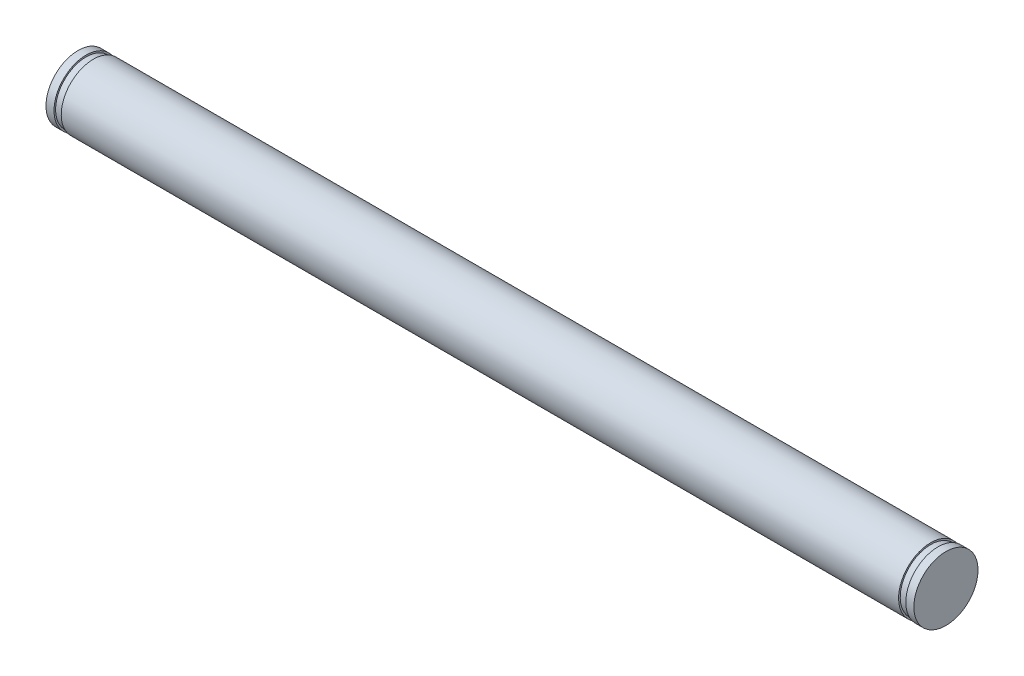
ISO-10303-21;
HEADER;
FILE_DESCRIPTION(('STEP AP214'),'2;1');
FILE_NAME('part.step','',(''),(''),'','','');
FILE_SCHEMA(('AUTOMOTIVE_DESIGN { 1 0 10303 214 1 1 1 1 }'));
ENDSEC;
DATA;
#1=APPLICATION_CONTEXT('core data for automotive mechanical design processes');
#2=APPLICATION_PROTOCOL_DEFINITION('international standard','automotive_design',2000,#1);
#3=PRODUCT_CONTEXT('',#1,'mechanical');
#4=PRODUCT('Part','Part','',(#3));
#5=PRODUCT_RELATED_PRODUCT_CATEGORY('part','',(#4));
#6=PRODUCT_DEFINITION_FORMATION('','',#4);
#7=PRODUCT_DEFINITION_CONTEXT('part definition',#1,'design');
#8=PRODUCT_DEFINITION('design','',#6,#7);
#9=PRODUCT_DEFINITION_SHAPE('','',#8);
#10=(LENGTH_UNIT() NAMED_UNIT(*) SI_UNIT(.MILLI.,.METRE.));
#11=(NAMED_UNIT(*) PLANE_ANGLE_UNIT() SI_UNIT($,.RADIAN.));
#12=(NAMED_UNIT(*) SI_UNIT($,.STERADIAN.) SOLID_ANGLE_UNIT());
#13=UNCERTAINTY_MEASURE_WITH_UNIT(LENGTH_MEASURE(1.E-05),#10,'distance_accuracy_value','');
#14=(GEOMETRIC_REPRESENTATION_CONTEXT(3) GLOBAL_UNCERTAINTY_ASSIGNED_CONTEXT((#13)) GLOBAL_UNIT_ASSIGNED_CONTEXT((#10,
#11,#12)) REPRESENTATION_CONTEXT('',''));
#15=CARTESIAN_POINT('',(0.,0.,0.));
#16=DIRECTION('',(0.,0.,1.));
#17=DIRECTION('',(1.,0.,0.));
#18=AXIS2_PLACEMENT_3D('',#15,#16,#17);
#19=CARTESIAN_POINT('',(0.,-0.200000000000025,0.));
#20=DIRECTION('',(-1.,0.,0.));
#21=DIRECTION('',(0.,-1.,0.));
#22=AXIS2_PLACEMENT_3D('',#19,#20,#21);
#23=PLANE('',#22);
#24=CARTESIAN_POINT('',(0.,-4.00000000000003,0.));
#25=DIRECTION('',(1.,0.,0.));
#26=DIRECTION('',(0.,1.,0.));
#27=AXIS2_PLACEMENT_3D('',#24,#25,#26);
#28=CIRCLE('',#27,3.8);
#29=CARTESIAN_POINT('',(0.,-0.200000000000025,0.));
#30=VERTEX_POINT('',#29);
#31=EDGE_CURVE('E67',#30,#30,#28,.T.);
#32=ORIENTED_EDGE('',*,*,#31,.T.);
#33=EDGE_LOOP('',(#32));
#34=FACE_BOUND('',#33,.T.);
#35=CARTESIAN_POINT('',(0.,-4.00000000000003,0.));
#36=DIRECTION('',(1.,0.,0.));
#37=DIRECTION('',(0.,1.,0.));
#38=AXIS2_PLACEMENT_3D('',#35,#36,#37);
#39=CIRCLE('',#38,4.00000000000003);
#40=CARTESIAN_POINT('',(0.,0.,0.));
#41=VERTEX_POINT('',#40);
#42=EDGE_CURVE('E10',#41,#41,#39,.T.);
#43=ORIENTED_EDGE('',*,*,#42,.F.);
#44=EDGE_LOOP('',(#43));
#45=FACE_BOUND('',#44,.T.);
#46=ADVANCED_FACE('F33',(#34,#45),#23,.T.);
#47=CARTESIAN_POINT('',(106.3,-3.99999999999999,0.));
#48=DIRECTION('',(1.,0.,0.));
#49=DIRECTION('',(0.,1.,0.));
#50=AXIS2_PLACEMENT_3D('',#47,#48,#49);
#51=CYLINDRICAL_SURFACE('',#50,4.00000000000002);
#52=ORIENTED_EDGE('',*,*,#42,.T.);
#53=EDGE_LOOP('',(#52));
#54=FACE_BOUND('',#53,.T.);
#55=CARTESIAN_POINT('',(104.4,-3.99999999999999,0.));
#56=DIRECTION('',(1.,0.,0.));
#57=DIRECTION('',(0.,1.,0.));
#58=AXIS2_PLACEMENT_3D('',#55,#56,#57);
#59=CIRCLE('',#58,4.);
#60=CARTESIAN_POINT('',(104.4,0.,0.));
#61=VERTEX_POINT('',#60);
#62=EDGE_CURVE('E39',#61,#61,#59,.T.);
#63=ORIENTED_EDGE('',*,*,#62,.F.);
#64=EDGE_LOOP('',(#63));
#65=FACE_BOUND('',#64,.T.);
#66=ADVANCED_FACE('F85',(#54,#65),#51,.T.);
#67=CARTESIAN_POINT('',(104.4,0.,0.));
#68=DIRECTION('',(1.,0.,0.));
#69=DIRECTION('',(0.,1.,0.));
#70=AXIS2_PLACEMENT_3D('',#67,#68,#69);
#71=PLANE('',#70);
#72=ORIENTED_EDGE('',*,*,#62,.T.);
#73=EDGE_LOOP('',(#72));
#74=FACE_BOUND('',#73,.T.);
#75=CARTESIAN_POINT('',(104.4,-3.99999999999999,0.));
#76=DIRECTION('',(1.,0.,0.));
#77=DIRECTION('',(0.,1.,0.));
#78=AXIS2_PLACEMENT_3D('',#75,#76,#77);
#79=CIRCLE('',#78,3.79999999999998);
#80=CARTESIAN_POINT('',(104.4,-0.200000000000012,0.));
#81=VERTEX_POINT('',#80);
#82=EDGE_CURVE('E43',#81,#81,#79,.T.);
#83=ORIENTED_EDGE('',*,*,#82,.F.);
#84=EDGE_LOOP('',(#83));
#85=FACE_BOUND('',#84,.T.);
#86=ADVANCED_FACE('F89',(#74,#85),#71,.T.);
#87=CARTESIAN_POINT('',(106.3,-3.99999999999999,0.));
#88=DIRECTION('',(1.,0.,0.));
#89=DIRECTION('',(0.,1.,0.));
#90=AXIS2_PLACEMENT_3D('',#87,#88,#89);
#91=CYLINDRICAL_SURFACE('',#90,3.79999999999998);
#92=ORIENTED_EDGE('',*,*,#82,.T.);
#93=EDGE_LOOP('',(#92));
#94=FACE_BOUND('',#93,.T.);
#95=CARTESIAN_POINT('',(105.3,-3.99999999999999,0.));
#96=DIRECTION('',(1.,0.,0.));
#97=DIRECTION('',(0.,1.,0.));
#98=AXIS2_PLACEMENT_3D('',#95,#96,#97);
#99=CIRCLE('',#98,3.79999999999998);
#100=CARTESIAN_POINT('',(105.3,-0.200000000000011,0.));
#101=VERTEX_POINT('',#100);
#102=EDGE_CURVE('E47',#101,#101,#99,.T.);
#103=ORIENTED_EDGE('',*,*,#102,.F.);
#104=EDGE_LOOP('',(#103));
#105=FACE_BOUND('',#104,.T.);
#106=ADVANCED_FACE('F93',(#94,#105),#91,.T.);
#107=CARTESIAN_POINT('',(105.3,-0.200000000000012,0.));
#108=DIRECTION('',(-1.,0.,0.));
#109=DIRECTION('',(0.,-1.,0.));
#110=AXIS2_PLACEMENT_3D('',#107,#108,#109);
#111=PLANE('',#110);
#112=ORIENTED_EDGE('',*,*,#102,.T.);
#113=EDGE_LOOP('',(#112));
#114=FACE_BOUND('',#113,.T.);
#115=CARTESIAN_POINT('',(105.3,-3.99999999999999,0.));
#116=DIRECTION('',(1.,0.,0.));
#117=DIRECTION('',(0.,1.,0.));
#118=AXIS2_PLACEMENT_3D('',#115,#116,#117);
#119=CIRCLE('',#118,3.99999999999999);
#120=CARTESIAN_POINT('',(105.3,0.,0.));
#121=VERTEX_POINT('',#120);
#122=EDGE_CURVE('E52',#121,#121,#119,.T.);
#123=ORIENTED_EDGE('',*,*,#122,.F.);
#124=EDGE_LOOP('',(#123));
#125=FACE_BOUND('',#124,.T.);
#126=ADVANCED_FACE('F99',(#114,#125),#111,.T.);
#127=CARTESIAN_POINT('',(106.3,-3.99999999999999,0.));
#128=DIRECTION('',(1.,0.,0.));
#129=DIRECTION('',(0.,1.,0.));
#130=AXIS2_PLACEMENT_3D('',#127,#128,#129);
#131=CYLINDRICAL_SURFACE('',#130,3.99999999999999);
#132=ORIENTED_EDGE('',*,*,#122,.T.);
#133=EDGE_LOOP('',(#132));
#134=FACE_BOUND('',#133,.T.);
#135=CARTESIAN_POINT('',(106.3,-3.99999999999999,0.));
#136=DIRECTION('',(1.,0.,0.));
#137=DIRECTION('',(0.,1.,0.));
#138=AXIS2_PLACEMENT_3D('',#135,#136,#137);
#139=CIRCLE('',#138,3.99999999999999);
#140=CARTESIAN_POINT('',(106.3,0.,0.));
#141=VERTEX_POINT('',#140);
#142=EDGE_CURVE('E55',#141,#141,#139,.T.);
#143=ORIENTED_EDGE('',*,*,#142,.F.);
#144=EDGE_LOOP('',(#143));
#145=FACE_BOUND('',#144,.T.);
#146=ADVANCED_FACE('F103',(#134,#145),#131,.T.);
#147=CARTESIAN_POINT('',(106.3,0.,0.));
#148=DIRECTION('',(1.,0.,0.));
#149=DIRECTION('',(0.,1.,0.));
#150=AXIS2_PLACEMENT_3D('',#147,#148,#149);
#151=PLANE('',#150);
#152=ORIENTED_EDGE('',*,*,#142,.T.);
#153=EDGE_LOOP('',(#152));
#154=FACE_BOUND('',#153,.T.);
#155=ADVANCED_FACE('F107',(#154),#151,.T.);
#156=CARTESIAN_POINT('',(-1.9,0.,0.));
#157=DIRECTION('',(-1.,0.,0.));
#158=DIRECTION('',(0.,-1.,0.));
#159=AXIS2_PLACEMENT_3D('',#156,#157,#158);
#160=PLANE('',#159);
#161=CARTESIAN_POINT('',(-1.9,-4.00000000000003,0.));
#162=DIRECTION('',(1.,0.,0.));
#163=DIRECTION('',(0.,1.,0.));
#164=AXIS2_PLACEMENT_3D('',#161,#162,#163);
#165=CIRCLE('',#164,4.00000000000002);
#166=CARTESIAN_POINT('',(-1.9,0.,0.));
#167=VERTEX_POINT('',#166);
#168=EDGE_CURVE('E58',#167,#167,#165,.T.);
#169=ORIENTED_EDGE('',*,*,#168,.F.);
#170=EDGE_LOOP('',(#169));
#171=FACE_BOUND('',#170,.T.);
#172=ADVANCED_FACE('F111',(#171),#160,.T.);
#173=CARTESIAN_POINT('',(106.3,-3.99999999999999,0.));
#174=DIRECTION('',(1.,0.,0.));
#175=DIRECTION('',(0.,1.,0.));
#176=AXIS2_PLACEMENT_3D('',#173,#174,#175);
#177=CYLINDRICAL_SURFACE('',#176,4.00000000000002);
#178=ORIENTED_EDGE('',*,*,#168,.T.);
#179=EDGE_LOOP('',(#178));
#180=FACE_BOUND('',#179,.T.);
#181=CARTESIAN_POINT('',(-0.899999999999998,-4.00000000000003,0.));
#182=DIRECTION('',(1.,0.,0.));
#183=DIRECTION('',(0.,1.,0.));
#184=AXIS2_PLACEMENT_3D('',#181,#182,#183);
#185=CIRCLE('',#184,4.00000000000003);
#186=CARTESIAN_POINT('',(-0.9,0.,0.));
#187=VERTEX_POINT('',#186);
#188=EDGE_CURVE('E61',#187,#187,#185,.T.);
#189=ORIENTED_EDGE('',*,*,#188,.F.);
#190=EDGE_LOOP('',(#189));
#191=FACE_BOUND('',#190,.T.);
#192=ADVANCED_FACE('F81',(#180,#191),#177,.T.);
#193=CARTESIAN_POINT('',(-0.899999999999998,-0.200000000000025,0.));
#194=DIRECTION('',(1.,0.,0.));
#195=DIRECTION('',(0.,1.,0.));
#196=AXIS2_PLACEMENT_3D('',#193,#194,#195);
#197=PLANE('',#196);
#198=ORIENTED_EDGE('',*,*,#188,.T.);
#199=EDGE_LOOP('',(#198));
#200=FACE_BOUND('',#199,.T.);
#201=CARTESIAN_POINT('',(-0.899999999999998,-4.00000000000003,0.));
#202=DIRECTION('',(1.,0.,0.));
#203=DIRECTION('',(0.,1.,0.));
#204=AXIS2_PLACEMENT_3D('',#201,#202,#203);
#205=CIRCLE('',#204,3.8);
#206=CARTESIAN_POINT('',(-0.9,-0.200000000000025,0.));
#207=VERTEX_POINT('',#206);
#208=EDGE_CURVE('E64',#207,#207,#205,.T.);
#209=ORIENTED_EDGE('',*,*,#208,.F.);
#210=EDGE_LOOP('',(#209));
#211=FACE_BOUND('',#210,.T.);
#212=ADVANCED_FACE('F75',(#200,#211),#197,.T.);
#213=CARTESIAN_POINT('',(106.3,-3.99999999999999,0.));
#214=DIRECTION('',(1.,0.,0.));
#215=DIRECTION('',(0.,1.,0.));
#216=AXIS2_PLACEMENT_3D('',#213,#214,#215);
#217=CYLINDRICAL_SURFACE('',#216,3.8);
#218=ORIENTED_EDGE('',*,*,#208,.T.);
#219=EDGE_LOOP('',(#218));
#220=FACE_BOUND('',#219,.T.);
#221=ORIENTED_EDGE('',*,*,#31,.F.);
#222=EDGE_LOOP('',(#221));
#223=FACE_BOUND('',#222,.T.);
#224=ADVANCED_FACE('F73',(#220,#223),#217,.T.);
#225=CLOSED_SHELL('',(#46,#66,#86,#106,#126,#146,#155,#172,#192,#212,#224));
#226=MANIFOLD_SOLID_BREP('B2',#225);
#227=ADVANCED_BREP_SHAPE_REPRESENTATION('',(#18,#226),#14);
#228=SHAPE_DEFINITION_REPRESENTATION(#9,#227);
ENDSEC;
END-ISO-10303-21;
